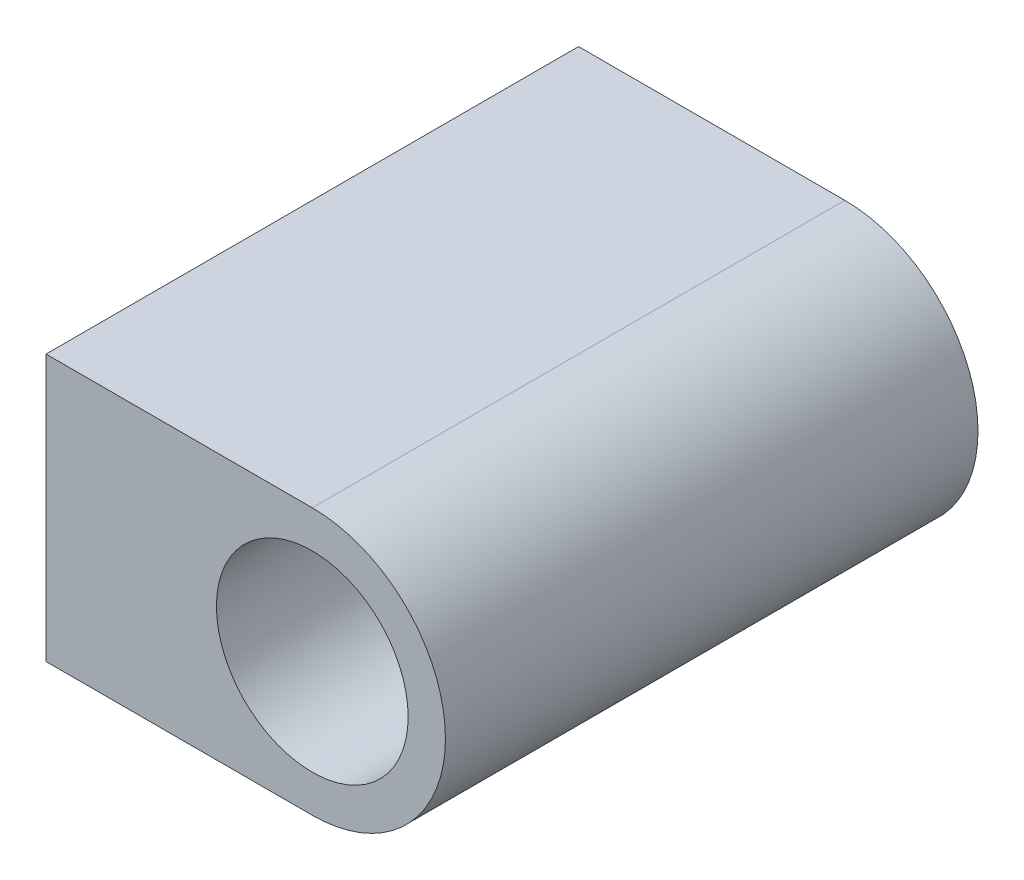
ISO-10303-21;
HEADER;
FILE_DESCRIPTION(('STEP AP214'),'2;1');
FILE_NAME('part.step','',(''),(''),'','','');
FILE_SCHEMA(('AUTOMOTIVE_DESIGN { 1 0 10303 214 1 1 1 1 }'));
ENDSEC;
DATA;
#1=APPLICATION_CONTEXT('core data for automotive mechanical design processes');
#2=APPLICATION_PROTOCOL_DEFINITION('international standard','automotive_design',2000,#1);
#3=PRODUCT_CONTEXT('',#1,'mechanical');
#4=PRODUCT('Part','Part','',(#3));
#5=PRODUCT_RELATED_PRODUCT_CATEGORY('part','',(#4));
#6=PRODUCT_DEFINITION_FORMATION('','',#4);
#7=PRODUCT_DEFINITION_CONTEXT('part definition',#1,'design');
#8=PRODUCT_DEFINITION('design','',#6,#7);
#9=PRODUCT_DEFINITION_SHAPE('','',#8);
#10=(LENGTH_UNIT() NAMED_UNIT(*) SI_UNIT(.MILLI.,.METRE.));
#11=(NAMED_UNIT(*) PLANE_ANGLE_UNIT() SI_UNIT($,.RADIAN.));
#12=(NAMED_UNIT(*) SI_UNIT($,.STERADIAN.) SOLID_ANGLE_UNIT());
#13=UNCERTAINTY_MEASURE_WITH_UNIT(LENGTH_MEASURE(1.E-05),#10,'distance_accuracy_value','');
#14=(GEOMETRIC_REPRESENTATION_CONTEXT(3) GLOBAL_UNCERTAINTY_ASSIGNED_CONTEXT((#13)) GLOBAL_UNIT_ASSIGNED_CONTEXT((#10,
#11,#12)) REPRESENTATION_CONTEXT('',''));
#15=CARTESIAN_POINT('',(0.,0.,0.));
#16=DIRECTION('',(0.,0.,1.));
#17=DIRECTION('',(1.,0.,0.));
#18=AXIS2_PLACEMENT_3D('',#15,#16,#17);
#19=CARTESIAN_POINT('',(0.,-2.5,10.));
#20=DIRECTION('',(0.,0.,-1.));
#21=DIRECTION('',(-1.,0.,0.));
#22=AXIS2_PLACEMENT_3D('',#19,#20,#21);
#23=PLANE('',#22);
#24=CARTESIAN_POINT('',(0.,-2.5,10.));
#25=DIRECTION('',(0.,0.,1.));
#26=DIRECTION('',(-1.,0.,0.));
#27=AXIS2_PLACEMENT_3D('',#24,#25,#26);
#28=CIRCLE('',#27,2.5);
#29=CARTESIAN_POINT('',(0.,-5.,10.));
#30=VERTEX_POINT('',#29);
#31=CARTESIAN_POINT('',(0.,0.,10.));
#32=VERTEX_POINT('',#31);
#33=EDGE_CURVE('E96',#30,#32,#28,.T.);
#34=ORIENTED_EDGE('',*,*,#33,.T.);
#35=DIRECTION('',(-1.,0.,0.));
#36=VECTOR('',#35,1.);
#37=CARTESIAN_POINT('',(0.,0.,10.));
#38=LINE('',#37,#36);
#39=CARTESIAN_POINT('',(-5.,0.,10.));
#40=VERTEX_POINT('',#39);
#41=EDGE_CURVE('E91',#32,#40,#38,.T.);
#42=ORIENTED_EDGE('',*,*,#41,.T.);
#43=DIRECTION('',(0.,-1.,0.));
#44=VECTOR('',#43,1.);
#45=CARTESIAN_POINT('',(-5.,0.,10.));
#46=LINE('',#45,#44);
#47=CARTESIAN_POINT('',(-5.,-5.,10.));
#48=VERTEX_POINT('',#47);
#49=EDGE_CURVE('E94',#40,#48,#46,.T.);
#50=ORIENTED_EDGE('',*,*,#49,.T.);
#51=DIRECTION('',(1.,0.,0.));
#52=VECTOR('',#51,1.);
#53=CARTESIAN_POINT('',(-5.,-5.,10.));
#54=LINE('',#53,#52);
#55=EDGE_CURVE('E61',#48,#30,#54,.T.);
#56=ORIENTED_EDGE('',*,*,#55,.T.);
#57=EDGE_LOOP('',(#34,#42,#50,#56));
#58=FACE_BOUND('',#57,.T.);
#59=CARTESIAN_POINT('',(0.,-2.5,10.));
#60=DIRECTION('',(0.,0.,1.));
#61=DIRECTION('',(1.,0.,0.));
#62=AXIS2_PLACEMENT_3D('',#59,#60,#61);
#63=CIRCLE('',#62,1.8);
#64=CARTESIAN_POINT('',(1.8,-2.5,10.));
#65=VERTEX_POINT('',#64);
#66=EDGE_CURVE('E116',#65,#65,#63,.T.);
#67=ORIENTED_EDGE('',*,*,#66,.F.);
#68=EDGE_LOOP('',(#67));
#69=FACE_BOUND('',#68,.T.);
#70=ADVANCED_FACE('F43',(#58,#69),#23,.F.);
#71=CARTESIAN_POINT('',(0.,-2.5,0.));
#72=DIRECTION('',(0.,0.,-1.));
#73=DIRECTION('',(-1.,0.,0.));
#74=AXIS2_PLACEMENT_3D('',#71,#72,#73);
#75=PLANE('',#74);
#76=CARTESIAN_POINT('',(0.,-2.5,0.));
#77=DIRECTION('',(0.,0.,1.));
#78=DIRECTION('',(-1.,0.,0.));
#79=AXIS2_PLACEMENT_3D('',#76,#77,#78);
#80=CIRCLE('',#79,2.5);
#81=CARTESIAN_POINT('',(0.,-5.,0.));
#82=VERTEX_POINT('',#81);
#83=CARTESIAN_POINT('',(0.,0.,0.));
#84=VERTEX_POINT('',#83);
#85=EDGE_CURVE('E112',#82,#84,#80,.T.);
#86=ORIENTED_EDGE('',*,*,#85,.F.);
#87=DIRECTION('',(1.,0.,0.));
#88=VECTOR('',#87,1.);
#89=CARTESIAN_POINT('',(-5.,-5.,0.));
#90=LINE('',#89,#88);
#91=CARTESIAN_POINT('',(-5.,-5.,0.));
#92=VERTEX_POINT('',#91);
#93=EDGE_CURVE('E84',#92,#82,#90,.T.);
#94=ORIENTED_EDGE('',*,*,#93,.F.);
#95=DIRECTION('',(0.,-1.,0.));
#96=VECTOR('',#95,1.);
#97=CARTESIAN_POINT('',(-5.,0.,0.));
#98=LINE('',#97,#96);
#99=CARTESIAN_POINT('',(-5.,0.,0.));
#100=VERTEX_POINT('',#99);
#101=EDGE_CURVE('E78',#100,#92,#98,.T.);
#102=ORIENTED_EDGE('',*,*,#101,.F.);
#103=DIRECTION('',(-1.,0.,0.));
#104=VECTOR('',#103,1.);
#105=CARTESIAN_POINT('',(0.,0.,0.));
#106=LINE('',#105,#104);
#107=EDGE_CURVE('E101',#84,#100,#106,.T.);
#108=ORIENTED_EDGE('',*,*,#107,.F.);
#109=EDGE_LOOP('',(#86,#94,#102,#108));
#110=FACE_BOUND('',#109,.T.);
#111=CARTESIAN_POINT('',(0.,-2.5,0.));
#112=DIRECTION('',(0.,0.,1.));
#113=DIRECTION('',(1.,0.,0.));
#114=AXIS2_PLACEMENT_3D('',#111,#112,#113);
#115=CIRCLE('',#114,1.8);
#116=CARTESIAN_POINT('',(1.8,-2.5,0.));
#117=VERTEX_POINT('',#116);
#118=EDGE_CURVE('E134',#117,#117,#115,.T.);
#119=ORIENTED_EDGE('',*,*,#118,.T.);
#120=EDGE_LOOP('',(#119));
#121=FACE_BOUND('',#120,.T.);
#122=ADVANCED_FACE('F129',(#110,#121),#75,.T.);
#123=CARTESIAN_POINT('',(0.,-2.5,10.));
#124=DIRECTION('',(0.,0.,-1.));
#125=DIRECTION('',(-1.,0.,0.));
#126=AXIS2_PLACEMENT_3D('',#123,#124,#125);
#127=CYLINDRICAL_SURFACE('',#126,2.5);
#128=ORIENTED_EDGE('',*,*,#85,.T.);
#129=DIRECTION('',(0.,0.,-1.));
#130=VECTOR('',#129,1.);
#131=CARTESIAN_POINT('',(0.,0.,10.));
#132=LINE('',#131,#130);
#133=EDGE_CURVE('E11',#32,#84,#132,.T.);
#134=ORIENTED_EDGE('',*,*,#133,.F.);
#135=ORIENTED_EDGE('',*,*,#33,.F.);
#136=DIRECTION('',(0.,0.,-1.));
#137=VECTOR('',#136,1.);
#138=CARTESIAN_POINT('',(0.,-5.,10.));
#139=LINE('',#138,#137);
#140=EDGE_CURVE('E108',#30,#82,#139,.T.);
#141=ORIENTED_EDGE('',*,*,#140,.T.);
#142=EDGE_LOOP('',(#128,#134,#135,#141));
#143=FACE_BOUND('',#142,.T.);
#144=ADVANCED_FACE('F45',(#143),#127,.T.);
#145=CARTESIAN_POINT('',(0.,0.,10.));
#146=DIRECTION('',(0.,-1.,0.));
#147=DIRECTION('',(0.,0.,-1.));
#148=AXIS2_PLACEMENT_3D('',#145,#146,#147);
#149=PLANE('',#148);
#150=ORIENTED_EDGE('',*,*,#107,.T.);
#151=DIRECTION('',(0.,0.,-1.));
#152=VECTOR('',#151,1.);
#153=CARTESIAN_POINT('',(-5.,0.,10.));
#154=LINE('',#153,#152);
#155=EDGE_CURVE('E53',#40,#100,#154,.T.);
#156=ORIENTED_EDGE('',*,*,#155,.F.);
#157=ORIENTED_EDGE('',*,*,#41,.F.);
#158=ORIENTED_EDGE('',*,*,#133,.T.);
#159=EDGE_LOOP('',(#150,#156,#157,#158));
#160=FACE_BOUND('',#159,.T.);
#161=ADVANCED_FACE('F100',(#160),#149,.F.);
#162=CARTESIAN_POINT('',(-5.,0.,10.));
#163=DIRECTION('',(1.,0.,0.));
#164=DIRECTION('',(0.,1.,0.));
#165=AXIS2_PLACEMENT_3D('',#162,#163,#164);
#166=PLANE('',#165);
#167=ORIENTED_EDGE('',*,*,#101,.T.);
#168=DIRECTION('',(0.,0.,-1.));
#169=VECTOR('',#168,1.);
#170=CARTESIAN_POINT('',(-5.,-5.,10.));
#171=LINE('',#170,#169);
#172=EDGE_CURVE('E103',#48,#92,#171,.T.);
#173=ORIENTED_EDGE('',*,*,#172,.F.);
#174=ORIENTED_EDGE('',*,*,#49,.F.);
#175=ORIENTED_EDGE('',*,*,#155,.T.);
#176=EDGE_LOOP('',(#167,#173,#174,#175));
#177=FACE_BOUND('',#176,.T.);
#178=ADVANCED_FACE('F104',(#177),#166,.F.);
#179=CARTESIAN_POINT('',(-5.,-5.,10.));
#180=DIRECTION('',(0.,1.,0.));
#181=DIRECTION('',(0.,0.,1.));
#182=AXIS2_PLACEMENT_3D('',#179,#180,#181);
#183=PLANE('',#182);
#184=ORIENTED_EDGE('',*,*,#93,.T.);
#185=ORIENTED_EDGE('',*,*,#140,.F.);
#186=ORIENTED_EDGE('',*,*,#55,.F.);
#187=ORIENTED_EDGE('',*,*,#172,.T.);
#188=EDGE_LOOP('',(#184,#185,#186,#187));
#189=FACE_BOUND('',#188,.T.);
#190=ADVANCED_FACE('F126',(#189),#183,.F.);
#191=CARTESIAN_POINT('',(0.,-2.5,10.));
#192=DIRECTION('',(0.,0.,-1.));
#193=DIRECTION('',(-1.,0.,0.));
#194=AXIS2_PLACEMENT_3D('',#191,#192,#193);
#195=CYLINDRICAL_SURFACE('',#194,1.8);
#196=ORIENTED_EDGE('',*,*,#66,.T.);
#197=EDGE_LOOP('',(#196));
#198=FACE_BOUND('',#197,.T.);
#199=ORIENTED_EDGE('',*,*,#118,.F.);
#200=EDGE_LOOP('',(#199));
#201=FACE_BOUND('',#200,.T.);
#202=ADVANCED_FACE('F142',(#198,#201),#195,.F.);
#203=CLOSED_SHELL('',(#70,#122,#144,#161,#178,#190,#202));
#204=MANIFOLD_SOLID_BREP('B2',#203);
#205=ADVANCED_BREP_SHAPE_REPRESENTATION('',(#18,#204),#14);
#206=SHAPE_DEFINITION_REPRESENTATION(#9,#205);
ENDSEC;
END-ISO-10303-21;
